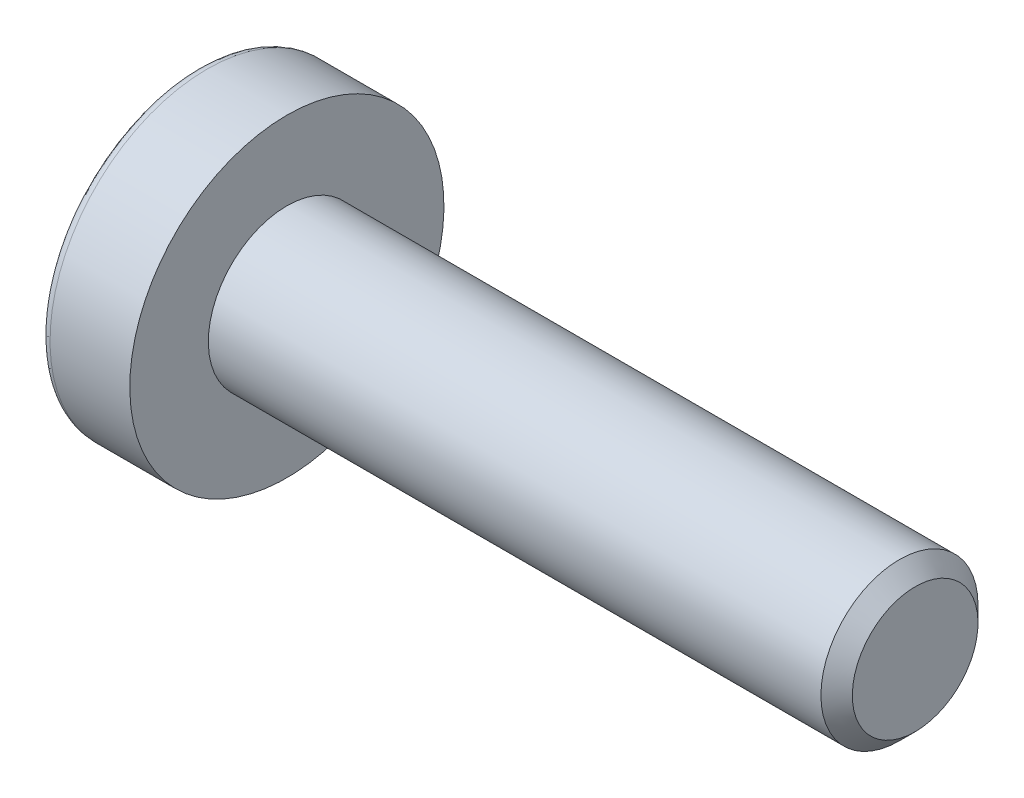
ISO-10303-21;
HEADER;
FILE_DESCRIPTION(('STEP AP214'),'2;1');
FILE_NAME('part.step','',(''),(''),'','','');
FILE_SCHEMA(('AUTOMOTIVE_DESIGN { 1 0 10303 214 1 1 1 1 }'));
ENDSEC;
DATA;
#1=APPLICATION_CONTEXT('core data for automotive mechanical design processes');
#2=APPLICATION_PROTOCOL_DEFINITION('international standard','automotive_design',2000,#1);
#3=PRODUCT_CONTEXT('',#1,'mechanical');
#4=PRODUCT('Part','Part','',(#3));
#5=PRODUCT_RELATED_PRODUCT_CATEGORY('part','',(#4));
#6=PRODUCT_DEFINITION_FORMATION('','',#4);
#7=PRODUCT_DEFINITION_CONTEXT('part definition',#1,'design');
#8=PRODUCT_DEFINITION('design','',#6,#7);
#9=PRODUCT_DEFINITION_SHAPE('','',#8);
#10=(LENGTH_UNIT() NAMED_UNIT(*) SI_UNIT(.MILLI.,.METRE.));
#11=(NAMED_UNIT(*) PLANE_ANGLE_UNIT() SI_UNIT($,.RADIAN.));
#12=(NAMED_UNIT(*) SI_UNIT($,.STERADIAN.) SOLID_ANGLE_UNIT());
#13=UNCERTAINTY_MEASURE_WITH_UNIT(LENGTH_MEASURE(1.E-05),#10,'distance_accuracy_value','');
#14=(GEOMETRIC_REPRESENTATION_CONTEXT(3) GLOBAL_UNCERTAINTY_ASSIGNED_CONTEXT((#13)) GLOBAL_UNIT_ASSIGNED_CONTEXT((#10,
#11,#12)) REPRESENTATION_CONTEXT('',''));
#15=CARTESIAN_POINT('',(0.,0.,0.));
#16=DIRECTION('',(0.,0.,1.));
#17=DIRECTION('',(1.,0.,0.));
#18=AXIS2_PLACEMENT_3D('',#15,#16,#17);
#19=CARTESIAN_POINT('',(-17.,-2.1,0.5));
#20=DIRECTION('',(0.052335956242944,0.,0.998629534754574));
#21=DIRECTION('',(0.998629534754574,0.,-0.052335956242944));
#22=AXIS2_PLACEMENT_3D('',#19,#20,#21);
#23=PLANE('',#22);
#24=DIRECTION('',(0.997264688634237,0.0522644276887144,-0.0522644276887139));
#25=VECTOR('',#24,1.);
#26=CARTESIAN_POINT('',(-18.9649809236718,-0.602980286543183,0.60298028654318));
#27=LINE('',#26,#25);
#28=CARTESIAN_POINT('',(-18.9649809236718,-0.602980286543183,0.602980286543179));
#29=VERTEX_POINT('',#28);
#30=CARTESIAN_POINT('',(-17.,-0.500000000000004,0.500000000000001));
#31=VERTEX_POINT('',#30);
#32=EDGE_CURVE('E392',#29,#31,#27,.T.);
#33=ORIENTED_EDGE('',*,*,#32,.T.);
#34=DIRECTION('',(0.,1.,0.));
#35=VECTOR('',#34,1.);
#36=CARTESIAN_POINT('',(-17.,-2.1,0.5));
#37=LINE('',#36,#35);
#38=CARTESIAN_POINT('',(-17.,-2.1,0.5));
#39=VERTEX_POINT('',#38);
#40=EDGE_CURVE('E98',#39,#31,#37,.T.);
#41=ORIENTED_EDGE('',*,*,#40,.F.);
#42=DIRECTION('',(-0.997264688634237,-0.0522644276887142,0.0522644276887141));
#43=VECTOR('',#42,1.);
#44=CARTESIAN_POINT('',(-17.,-2.1,0.5));
#45=LINE('',#44,#43);
#46=CARTESIAN_POINT('',(-18.7492116166374,-2.19167229632422,0.591672296324065));
#47=VERTEX_POINT('',#46);
#48=EDGE_CURVE('E319',#39,#47,#45,.T.);
#49=ORIENTED_EDGE('',*,*,#48,.T.);
#50=CARTESIAN_POINT('',(-18.9649809236718,-0.602980286543183,0.602980286543179));
#51=CARTESIAN_POINT('',(-18.9494321809181,-0.870542282454416,0.602165411464815));
#52=CARTESIAN_POINT('',(-18.9236770339551,-1.13671428122513,0.600815641407373));
#53=CARTESIAN_POINT('',(-18.8517539316103,-1.66627828448553,0.597046311334334));
#54=CARTESIAN_POINT('',(-18.8055859762285,-1.92967028897521,0.594626751318737));
#55=CARTESIAN_POINT('',(-18.7492116166374,-2.19167229632437,0.591672296324061));
#56=B_SPLINE_CURVE_WITH_KNOTS('',3,(#50,#51,#52,#53,#54,#55),.UNSPECIFIED.,.F.,.F.,(4,2,4),(0.,
0.802255658524791,1.60451131704958),.UNSPECIFIED.);
#57=EDGE_CURVE('E20',#29,#47,#56,.T.);
#58=ORIENTED_EDGE('',*,*,#57,.F.);
#59=EDGE_LOOP('',(#33,#41,#49,#58));
#60=FACE_BOUND('',#59,.T.);
#61=ADVANCED_FACE('F16',(#60),#23,.F.);
#62=CARTESIAN_POINT('',(-17.,-0.499999999999995,-2.1));
#63=DIRECTION('',(0.0523359562429441,-0.998629534754574,0.));
#64=DIRECTION('',(0.998629534754574,0.0523359562429441,0.));
#65=AXIS2_PLACEMENT_3D('',#62,#63,#64);
#66=PLANE('',#65);
#67=DIRECTION('',(0.997264688634237,0.0522644276887144,-0.0522644276887137));
#68=VECTOR('',#67,1.);
#69=CARTESIAN_POINT('',(-18.7492116166374,-0.591672296324076,2.19167229632406));
#70=LINE('',#69,#68);
#71=CARTESIAN_POINT('',(-18.7492116166374,-0.591672296324076,2.19167229632407));
#72=VERTEX_POINT('',#71);
#73=CARTESIAN_POINT('',(-17.,-0.500000000000009,2.1));
#74=VERTEX_POINT('',#73);
#75=EDGE_CURVE('E307',#72,#74,#70,.T.);
#76=ORIENTED_EDGE('',*,*,#75,.T.);
#77=DIRECTION('',(0.,0.,1.));
#78=VECTOR('',#77,1.);
#79=CARTESIAN_POINT('',(-17.,-0.499999999999995,-2.1));
#80=LINE('',#79,#78);
#81=EDGE_CURVE('E390',#31,#74,#80,.T.);
#82=ORIENTED_EDGE('',*,*,#81,.F.);
#83=ORIENTED_EDGE('',*,*,#32,.F.);
#84=CARTESIAN_POINT('',(-18.7492116166374,-0.591672296324076,2.19167229632407));
#85=CARTESIAN_POINT('',(-18.8055859762285,-0.594626751318749,1.92967028897495));
#86=CARTESIAN_POINT('',(-18.8517539316103,-0.597046311334344,1.66627828448532));
#87=CARTESIAN_POINT('',(-18.9236770339551,-0.60081564140738,1.13671428122503));
#88=CARTESIAN_POINT('',(-18.9494321809181,-0.60216541146482,0.870542282454362));
#89=CARTESIAN_POINT('',(-18.9649809236718,-0.602980286543182,0.602980286543181));
#90=B_SPLINE_CURVE_WITH_KNOTS('',3,(#84,#85,#86,#87,#88,#89),.UNSPECIFIED.,.F.,.F.,(4,2,4),(0.,
0.802255658524635,1.60451131704927),.UNSPECIFIED.);
#91=EDGE_CURVE('E238',#72,#29,#90,.T.);
#92=ORIENTED_EDGE('',*,*,#91,.F.);
#93=EDGE_LOOP('',(#76,#82,#83,#92));
#94=FACE_BOUND('',#93,.T.);
#95=ADVANCED_FACE('F330',(#94),#66,.F.);
#96=CARTESIAN_POINT('',(-17.,-2.1,0.5));
#97=DIRECTION('',(0.0523359562429441,-0.998629534754574,0.));
#98=DIRECTION('',(0.998629534754574,0.0523359562429441,0.));
#99=AXIS2_PLACEMENT_3D('',#96,#97,#98);
#100=PLANE('',#99);
#101=CARTESIAN_POINT('',(-18.7492116166374,-2.19167229632407,0.591672296324066));
#102=CARTESIAN_POINT('',(-18.7662509048177,-2.19256528757816,0.296082175208422));
#103=CARTESIAN_POINT('',(-18.7662509048177,-2.19256528757816,0.));
#104=B_SPLINE_CURVE_WITH_KNOTS('',2,(#101,#102,#103),.UNSPECIFIED.,.F.,.F.,(3,3),(0.,1.),.UNSPECIFIED.);
#105=CARTESIAN_POINT('',(-18.7662509048177,-2.19256528757816,0.));
#106=VERTEX_POINT('',#105);
#107=EDGE_CURVE('E316',#47,#106,#104,.T.);
#108=ORIENTED_EDGE('',*,*,#107,.F.);
#109=ORIENTED_EDGE('',*,*,#48,.F.);
#110=DIRECTION('',(0.,0.,1.));
#111=VECTOR('',#110,1.);
#112=CARTESIAN_POINT('',(-17.,-2.1,0.5));
#113=LINE('',#112,#111);
#114=CARTESIAN_POINT('',(-17.,-2.1,-0.500000000000001));
#115=VERTEX_POINT('',#114);
#116=EDGE_CURVE('E398',#115,#39,#113,.T.);
#117=ORIENTED_EDGE('',*,*,#116,.F.);
#118=DIRECTION('',(-0.997264688634237,-0.0522644276887142,-0.052264427688714));
#119=VECTOR('',#118,1.);
#120=CARTESIAN_POINT('',(-17.,-2.1,-0.5));
#121=LINE('',#120,#119);
#122=CARTESIAN_POINT('',(-18.7492116166374,-2.19167229632407,-0.591672296324066));
#123=VERTEX_POINT('',#122);
#124=EDGE_CURVE('E286',#115,#123,#121,.T.);
#125=ORIENTED_EDGE('',*,*,#124,.T.);
#126=CARTESIAN_POINT('',(-18.7662509048177,-2.19256528757816,0.));
#127=CARTESIAN_POINT('',(-18.7662509048177,-2.19256528757816,-0.296082175208425));
#128=CARTESIAN_POINT('',(-18.7492116166374,-2.19167229632407,-0.591672296324067));
#129=B_SPLINE_CURVE_WITH_KNOTS('',2,(#126,#127,#128),.UNSPECIFIED.,.F.,.F.,(3,3),(0.,1.),.UNSPECIFIED.);
#130=EDGE_CURVE('E310',#106,#123,#129,.T.);
#131=ORIENTED_EDGE('',*,*,#130,.F.);
#132=EDGE_LOOP('',(#108,#109,#117,#125,#131));
#133=FACE_BOUND('',#132,.T.);
#134=ADVANCED_FACE('F322',(#133),#100,.F.);
#135=CARTESIAN_POINT('',(-17.,-0.500000000000009,2.1));
#136=DIRECTION('',(0.052335956242944,0.,0.998629534754574));
#137=DIRECTION('',(0.998629534754574,0.,-0.052335956242944));
#138=AXIS2_PLACEMENT_3D('',#135,#136,#137);
#139=PLANE('',#138);
#140=DIRECTION('',(0.997264688634237,-0.0522644276887137,-0.0522644276887149));
#141=VECTOR('',#140,1.);
#142=CARTESIAN_POINT('',(-18.7492116166374,0.591672296324056,2.19167229632407));
#143=LINE('',#142,#141);
#144=CARTESIAN_POINT('',(-18.7492116166374,0.591672296324055,2.19167229632407));
#145=VERTEX_POINT('',#144);
#146=CARTESIAN_POINT('',(-17.,0.499999999999991,2.1));
#147=VERTEX_POINT('',#146);
#148=EDGE_CURVE('E290',#145,#147,#143,.T.);
#149=ORIENTED_EDGE('',*,*,#148,.T.);
#150=DIRECTION('',(0.,1.,0.));
#151=VECTOR('',#150,1.);
#152=CARTESIAN_POINT('',(-17.,-0.500000000000009,2.1));
#153=LINE('',#152,#151);
#154=EDGE_CURVE('E298',#74,#147,#153,.T.);
#155=ORIENTED_EDGE('',*,*,#154,.F.);
#156=ORIENTED_EDGE('',*,*,#75,.F.);
#157=CARTESIAN_POINT('',(-18.7492116166374,0.591672296324055,2.19167229632407));
#158=CARTESIAN_POINT('',(-18.760571142091,0.394448197549367,2.1922676238268));
#159=CARTESIAN_POINT('',(-18.7662509048177,0.197224098774678,2.19256528757816));
#160=CARTESIAN_POINT('',(-18.7662509048177,-0.197224098774699,2.19256528757816));
#161=CARTESIAN_POINT('',(-18.760571142091,-0.394448197549388,2.19226762382679));
#162=CARTESIAN_POINT('',(-18.7492116166374,-0.591672296324076,2.19167229632407));
#163=B_SPLINE_CURVE_WITH_KNOTS('',3,(#157,#158,#159,#160,#161,#162),.UNSPECIFIED.,.F.,.F.,(4,2,
4),(0.,0.591918272240741,1.18383654448148),.UNSPECIFIED.);
#164=EDGE_CURVE('E246',#145,#72,#163,.T.);
#165=ORIENTED_EDGE('',*,*,#164,.F.);
#166=EDGE_LOOP('',(#149,#155,#156,#165));
#167=FACE_BOUND('',#166,.T.);
#168=ADVANCED_FACE('F276',(#167),#139,.F.);
#169=CARTESIAN_POINT('',(-17.,-2.1,-0.5));
#170=DIRECTION('',(0.052335956242944,0.,-0.998629534754574));
#171=DIRECTION('',(-0.998629534754574,0.,-0.052335956242944));
#172=AXIS2_PLACEMENT_3D('',#169,#170,#171);
#173=PLANE('',#172);
#174=DIRECTION('',(-0.997264688634237,-0.052264427688714,-0.052264427688714));
#175=VECTOR('',#174,1.);
#176=CARTESIAN_POINT('',(-17.,-0.5,-0.499999999999999));
#177=LINE('',#176,#175);
#178=CARTESIAN_POINT('',(-17.,-0.5,-0.499999999999999));
#179=VERTEX_POINT('',#178);
#180=CARTESIAN_POINT('',(-18.9649809236718,-0.602980286543179,-0.602980286543179));
#181=VERTEX_POINT('',#180);
#182=EDGE_CURVE('E263',#179,#181,#177,.T.);
#183=ORIENTED_EDGE('',*,*,#182,.T.);
#184=CARTESIAN_POINT('',(-18.7492116166374,-2.19167229632437,-0.591672296324067));
#185=CARTESIAN_POINT('',(-18.8055859762285,-1.92967028897521,-0.594626751318739));
#186=CARTESIAN_POINT('',(-18.8517539316103,-1.66627828448553,-0.597046311334335));
#187=CARTESIAN_POINT('',(-18.9236770339551,-1.13671428122513,-0.600815641407373));
#188=CARTESIAN_POINT('',(-18.9494321809181,-0.870542282454412,-0.602165411464815));
#189=CARTESIAN_POINT('',(-18.9649809236718,-0.602980286543178,-0.60298028654318));
#190=B_SPLINE_CURVE_WITH_KNOTS('',3,(#184,#185,#186,#187,#188,#189),.UNSPECIFIED.,.F.,.F.,(4,2,
4),(0.,0.802255658524794,1.60451131704959),.UNSPECIFIED.);
#191=EDGE_CURVE('E280',#123,#181,#190,.T.);
#192=ORIENTED_EDGE('',*,*,#191,.F.);
#193=ORIENTED_EDGE('',*,*,#124,.F.);
#194=DIRECTION('',(0.,1.,0.));
#195=VECTOR('',#194,1.);
#196=CARTESIAN_POINT('',(-17.,-2.1,-0.5));
#197=LINE('',#196,#195);
#198=EDGE_CURVE('E285',#179,#115,#197,.F.);
#199=ORIENTED_EDGE('',*,*,#198,.F.);
#200=EDGE_LOOP('',(#183,#192,#193,#199));
#201=FACE_BOUND('',#200,.T.);
#202=ADVANCED_FACE('F272',(#201),#173,.F.);
#203=CARTESIAN_POINT('',(-17.,0.500000000000005,-2.1));
#204=DIRECTION('',(0.0523359562429438,0.998629534754574,0.));
#205=DIRECTION('',(-0.998629534754574,0.0523359562429438,0.));
#206=AXIS2_PLACEMENT_3D('',#203,#204,#205);
#207=PLANE('',#206);
#208=DIRECTION('',(0.997264688634237,-0.0522644276887128,-0.0522644276887141));
#209=VECTOR('',#208,1.);
#210=CARTESIAN_POINT('',(-18.9649809236718,0.602980286543174,0.602980286543179));
#211=LINE('',#210,#209);
#212=CARTESIAN_POINT('',(-18.9649809236718,0.602980286543173,0.602980286543179));
#213=VERTEX_POINT('',#212);
#214=CARTESIAN_POINT('',(-17.,0.499999999999997,0.5));
#215=VERTEX_POINT('',#214);
#216=EDGE_CURVE('E417',#213,#215,#211,.T.);
#217=ORIENTED_EDGE('',*,*,#216,.T.);
#218=DIRECTION('',(0.,0.,1.));
#219=VECTOR('',#218,1.);
#220=CARTESIAN_POINT('',(-17.,0.500000000000005,-2.1));
#221=LINE('',#220,#219);
#222=EDGE_CURVE('E410',#147,#215,#221,.F.);
#223=ORIENTED_EDGE('',*,*,#222,.F.);
#224=ORIENTED_EDGE('',*,*,#148,.F.);
#225=CARTESIAN_POINT('',(-18.9649809236718,0.602980286543173,0.602980286543179));
#226=CARTESIAN_POINT('',(-18.9494321809181,0.602165411464808,0.87054228245436));
#227=CARTESIAN_POINT('',(-18.9236770339551,0.600815641407367,1.13671428122503));
#228=CARTESIAN_POINT('',(-18.8517539316103,0.597046311334329,1.66627828448532));
#229=CARTESIAN_POINT('',(-18.8055859762285,0.594626751318733,1.92967028897495));
#230=CARTESIAN_POINT('',(-18.7492116166374,0.591672296324059,2.19167229632407));
#231=B_SPLINE_CURVE_WITH_KNOTS('',3,(#225,#226,#227,#228,#229,#230),.UNSPECIFIED.,.F.,.F.,(4,2,
4),(0.,0.802255658524637,1.60451131704927),.UNSPECIFIED.);
#232=EDGE_CURVE('E231',#213,#145,#231,.T.);
#233=ORIENTED_EDGE('',*,*,#232,.F.);
#234=EDGE_LOOP('',(#217,#223,#224,#233));
#235=FACE_BOUND('',#234,.T.);
#236=ADVANCED_FACE('F267',(#235),#207,.F.);
#237=CARTESIAN_POINT('',(-17.,-0.499999999999995,-2.1));
#238=DIRECTION('',(0.0523359562429441,-0.998629534754574,0.));
#239=DIRECTION('',(0.998629534754574,0.0523359562429441,0.));
#240=AXIS2_PLACEMENT_3D('',#237,#238,#239);
#241=PLANE('',#240);
#242=ORIENTED_EDGE('',*,*,#182,.F.);
#243=DIRECTION('',(0.,0.,1.));
#244=VECTOR('',#243,1.);
#245=CARTESIAN_POINT('',(-17.,-0.499999999999995,-2.1));
#246=LINE('',#245,#244);
#247=CARTESIAN_POINT('',(-17.,-0.499999999999995,-2.1));
#248=VERTEX_POINT('',#247);
#249=EDGE_CURVE('E419',#248,#179,#246,.T.);
#250=ORIENTED_EDGE('',*,*,#249,.F.);
#251=DIRECTION('',(-0.997264688634237,-0.0522644276887138,-0.0522644276887142));
#252=VECTOR('',#251,1.);
#253=CARTESIAN_POINT('',(-17.,-0.499999999999995,-2.1));
#254=LINE('',#253,#252);
#255=CARTESIAN_POINT('',(-18.7492116166374,-0.59167229632406,-2.19167229632407));
#256=VERTEX_POINT('',#255);
#257=EDGE_CURVE('E204',#248,#256,#254,.T.);
#258=ORIENTED_EDGE('',*,*,#257,.T.);
#259=CARTESIAN_POINT('',(-18.9649809236718,-0.602980286543178,-0.60298028654318));
#260=CARTESIAN_POINT('',(-18.9494321809181,-0.602165411464813,-0.870542282454361));
#261=CARTESIAN_POINT('',(-18.9236770339551,-0.600815641407371,-1.13671428122503));
#262=CARTESIAN_POINT('',(-18.8517539316103,-0.597046311334333,-1.66627828448532));
#263=CARTESIAN_POINT('',(-18.8055859762285,-0.594626751318737,-1.92967028897495));
#264=CARTESIAN_POINT('',(-18.7492116166374,-0.591672296324064,-2.19167229632407));
#265=B_SPLINE_CURVE_WITH_KNOTS('',3,(#259,#260,#261,#262,#263,#264),.UNSPECIFIED.,.F.,.F.,(4,2,
4),(0.,0.802255658524637,1.60451131704928),.UNSPECIFIED.);
#266=EDGE_CURVE('E258',#181,#256,#265,.T.);
#267=ORIENTED_EDGE('',*,*,#266,.F.);
#268=EDGE_LOOP('',(#242,#250,#258,#267));
#269=FACE_BOUND('',#268,.T.);
#270=ADVANCED_FACE('F264',(#269),#241,.F.);
#271=CARTESIAN_POINT('',(-17.,-2.1,0.5));
#272=DIRECTION('',(0.052335956242944,0.,0.998629534754574));
#273=DIRECTION('',(0.998629534754574,0.,-0.052335956242944));
#274=AXIS2_PLACEMENT_3D('',#271,#272,#273);
#275=PLANE('',#274);
#276=ORIENTED_EDGE('',*,*,#216,.F.);
#277=CARTESIAN_POINT('',(-18.7492116166374,2.19167229632437,0.591672296324063));
#278=CARTESIAN_POINT('',(-18.8055859762285,1.9296702889752,0.594626751318737));
#279=CARTESIAN_POINT('',(-18.8517539316103,1.66627828448552,0.597046311334334));
#280=CARTESIAN_POINT('',(-18.9236770339551,1.13671428122512,0.600815641407373));
#281=CARTESIAN_POINT('',(-18.9494321809181,0.870542282454407,0.602165411464814));
#282=CARTESIAN_POINT('',(-18.9649809236718,0.602980286543174,0.602980286543178));
#283=B_SPLINE_CURVE_WITH_KNOTS('',3,(#277,#278,#279,#280,#281,#282),.UNSPECIFIED.,.F.,.F.,(4,2,
4),(0.,0.802255658524794,1.60451131704959),.UNSPECIFIED.);
#284=CARTESIAN_POINT('',(-18.7492116166374,2.19167229632422,0.591672296324065));
#285=VERTEX_POINT('',#284);
#286=EDGE_CURVE('E209',#285,#213,#283,.T.);
#287=ORIENTED_EDGE('',*,*,#286,.F.);
#288=DIRECTION('',(0.997264688634237,-0.0522644276887139,-0.0522644276887141));
#289=VECTOR('',#288,1.);
#290=CARTESIAN_POINT('',(-18.7492116166374,2.19167229632406,0.591672296324066));
#291=LINE('',#290,#289);
#292=CARTESIAN_POINT('',(-17.,2.1,0.5));
#293=VERTEX_POINT('',#292);
#294=EDGE_CURVE('E173',#285,#293,#291,.T.);
#295=ORIENTED_EDGE('',*,*,#294,.T.);
#296=DIRECTION('',(0.,1.,0.));
#297=VECTOR('',#296,1.);
#298=CARTESIAN_POINT('',(-17.,-2.1,0.5));
#299=LINE('',#298,#297);
#300=EDGE_CURVE('E431',#215,#293,#299,.T.);
#301=ORIENTED_EDGE('',*,*,#300,.F.);
#302=EDGE_LOOP('',(#276,#287,#295,#301));
#303=FACE_BOUND('',#302,.T.);
#304=ADVANCED_FACE('F192',(#303),#275,.F.);
#305=CARTESIAN_POINT('',(-17.,-0.499999999999995,-2.1));
#306=DIRECTION('',(0.052335956242944,0.,-0.998629534754574));
#307=DIRECTION('',(-0.998629534754574,0.,-0.052335956242944));
#308=AXIS2_PLACEMENT_3D('',#305,#306,#307);
#309=PLANE('',#308);
#310=ORIENTED_EDGE('',*,*,#257,.F.);
#311=DIRECTION('',(0.,1.,0.));
#312=VECTOR('',#311,1.);
#313=CARTESIAN_POINT('',(-17.,2.1,-2.1));
#314=LINE('',#313,#312);
#315=CARTESIAN_POINT('',(-17.,0.500000000000003,-2.1));
#316=VERTEX_POINT('',#315);
#317=EDGE_CURVE('E166',#316,#248,#314,.F.);
#318=ORIENTED_EDGE('',*,*,#317,.F.);
#319=DIRECTION('',(-0.997264688634237,0.0522644276887141,-0.0522644276887135));
#320=VECTOR('',#319,1.);
#321=CARTESIAN_POINT('',(-17.,0.500000000000005,-2.1));
#322=LINE('',#321,#320);
#323=CARTESIAN_POINT('',(-18.7492116166374,0.591672296324072,-2.19167229632406));
#324=VERTEX_POINT('',#323);
#325=EDGE_CURVE('E140',#316,#324,#322,.T.);
#326=ORIENTED_EDGE('',*,*,#325,.T.);
#327=CARTESIAN_POINT('',(-18.7492116166374,-0.59167229632406,-2.19167229632407));
#328=CARTESIAN_POINT('',(-18.760571142091,-0.394448197549372,-2.1922676238268));
#329=CARTESIAN_POINT('',(-18.7662509048177,-0.197224098774683,-2.19256528757816));
#330=CARTESIAN_POINT('',(-18.7662509048177,0.197224098774694,-2.19256528757816));
#331=CARTESIAN_POINT('',(-18.760571142091,0.394448197549383,-2.19226762382679));
#332=CARTESIAN_POINT('',(-18.7492116166374,0.591672296324071,-2.19167229632406));
#333=B_SPLINE_CURVE_WITH_KNOTS('',3,(#327,#328,#329,#330,#331,#332),.UNSPECIFIED.,.F.,.F.,(4,2,
4),(0.,0.591918272240741,1.18383654448148),.UNSPECIFIED.);
#334=EDGE_CURVE('E197',#256,#324,#333,.T.);
#335=ORIENTED_EDGE('',*,*,#334,.F.);
#336=EDGE_LOOP('',(#310,#318,#326,#335));
#337=FACE_BOUND('',#336,.T.);
#338=ADVANCED_FACE('F186',(#337),#309,.F.);
#339=CARTESIAN_POINT('',(-17.,2.1,0.5));
#340=DIRECTION('',(0.0523359562429438,0.998629534754574,0.));
#341=DIRECTION('',(-0.998629534754574,0.0523359562429438,0.));
#342=AXIS2_PLACEMENT_3D('',#339,#340,#341);
#343=PLANE('',#342);
#344=CARTESIAN_POINT('',(-18.7492116166374,2.19167229632406,-0.591672296324067));
#345=CARTESIAN_POINT('',(-18.7662509048177,2.19256528757816,-0.296082175208414));
#346=CARTESIAN_POINT('',(-18.7662509048177,2.19256528757816,0.));
#347=B_SPLINE_CURVE_WITH_KNOTS('',2,(#344,#345,#346),.UNSPECIFIED.,.F.,.F.,(3,3),(0.,1.),.UNSPECIFIED.);
#348=CARTESIAN_POINT('',(-18.7492116166374,2.19167229632407,-0.591672296324066));
#349=VERTEX_POINT('',#348);
#350=CARTESIAN_POINT('',(-18.7662509048177,2.19256528757816,0.));
#351=VERTEX_POINT('',#350);
#352=EDGE_CURVE('E40',#349,#351,#347,.T.);
#353=ORIENTED_EDGE('',*,*,#352,.F.);
#354=DIRECTION('',(0.997264688634237,-0.0522644276887144,0.052264427688714));
#355=VECTOR('',#354,1.);
#356=CARTESIAN_POINT('',(-18.7492116166374,2.19167229632407,-0.591672296324066));
#357=LINE('',#356,#355);
#358=CARTESIAN_POINT('',(-17.,2.1,-0.5));
#359=VERTEX_POINT('',#358);
#360=EDGE_CURVE('E132',#349,#359,#357,.T.);
#361=ORIENTED_EDGE('',*,*,#360,.T.);
#362=DIRECTION('',(0.,0.,1.));
#363=VECTOR('',#362,1.);
#364=CARTESIAN_POINT('',(-17.,2.1,0.5));
#365=LINE('',#364,#363);
#366=EDGE_CURVE('E128',#293,#359,#365,.F.);
#367=ORIENTED_EDGE('',*,*,#366,.F.);
#368=ORIENTED_EDGE('',*,*,#294,.F.);
#369=CARTESIAN_POINT('',(-18.7662509048177,2.19256528757816,0.));
#370=CARTESIAN_POINT('',(-18.7662509048177,2.19256528757816,0.29608217520846));
#371=CARTESIAN_POINT('',(-18.7492116166374,2.19167229632406,0.591672296324066));
#372=B_SPLINE_CURVE_WITH_KNOTS('',2,(#369,#370,#371),.UNSPECIFIED.,.F.,.F.,(3,3),(0.,1.),.UNSPECIFIED.);
#373=EDGE_CURVE('E172',#351,#285,#372,.T.);
#374=ORIENTED_EDGE('',*,*,#373,.F.);
#375=EDGE_LOOP('',(#353,#361,#367,#368,#374));
#376=FACE_BOUND('',#375,.T.);
#377=ADVANCED_FACE('F176',(#376),#343,.F.);
#378=CARTESIAN_POINT('',(-17.,2.1,0.5));
#379=DIRECTION('',(-1.,0.,0.));
#380=DIRECTION('',(0.,0.,1.));
#381=AXIS2_PLACEMENT_3D('',#378,#379,#380);
#382=PLANE('',#381);
#383=ORIENTED_EDGE('',*,*,#300,.T.);
#384=ORIENTED_EDGE('',*,*,#366,.T.);
#385=DIRECTION('',(0.,1.,0.));
#386=VECTOR('',#385,1.);
#387=CARTESIAN_POINT('',(-17.,-2.1,-0.5));
#388=LINE('',#387,#386);
#389=CARTESIAN_POINT('',(-17.,0.499999999999999,-0.5));
#390=VERTEX_POINT('',#389);
#391=EDGE_CURVE('E121',#359,#390,#388,.F.);
#392=ORIENTED_EDGE('',*,*,#391,.T.);
#393=DIRECTION('',(0.,0.,1.));
#394=VECTOR('',#393,1.);
#395=CARTESIAN_POINT('',(-17.,0.500000000000005,-2.1));
#396=LINE('',#395,#394);
#397=EDGE_CURVE('E125',#390,#316,#396,.F.);
#398=ORIENTED_EDGE('',*,*,#397,.T.);
#399=ORIENTED_EDGE('',*,*,#317,.T.);
#400=ORIENTED_EDGE('',*,*,#249,.T.);
#401=ORIENTED_EDGE('',*,*,#198,.T.);
#402=ORIENTED_EDGE('',*,*,#116,.T.);
#403=ORIENTED_EDGE('',*,*,#40,.T.);
#404=ORIENTED_EDGE('',*,*,#81,.T.);
#405=ORIENTED_EDGE('',*,*,#154,.T.);
#406=ORIENTED_EDGE('',*,*,#222,.T.);
#407=EDGE_LOOP('',(#383,#384,#392,#398,#399,#400,#401,#402,#403,#404,#405,#406));
#408=FACE_BOUND('',#407,.T.);
#409=ADVANCED_FACE('F123',(#408),#382,.T.);
#410=CARTESIAN_POINT('',(-17.,0.500000000000005,-2.1));
#411=DIRECTION('',(0.0523359562429438,0.998629534754574,0.));
#412=DIRECTION('',(-0.998629534754574,0.0523359562429438,0.));
#413=AXIS2_PLACEMENT_3D('',#410,#411,#412);
#414=PLANE('',#413);
#415=ORIENTED_EDGE('',*,*,#325,.F.);
#416=ORIENTED_EDGE('',*,*,#397,.F.);
#417=DIRECTION('',(-0.997264688634237,0.0522644276887141,-0.0522644276887141));
#418=VECTOR('',#417,1.);
#419=CARTESIAN_POINT('',(-17.,0.5,-0.5));
#420=LINE('',#419,#418);
#421=CARTESIAN_POINT('',(-18.9649809236718,0.602980286543178,-0.602980286543179));
#422=VERTEX_POINT('',#421);
#423=EDGE_CURVE('E131',#390,#422,#420,.T.);
#424=ORIENTED_EDGE('',*,*,#423,.T.);
#425=CARTESIAN_POINT('',(-18.7492116166374,0.591672296324071,-2.19167229632407));
#426=CARTESIAN_POINT('',(-18.8055859762285,0.594626751318744,-1.92967028897495));
#427=CARTESIAN_POINT('',(-18.8517539316103,0.597046311334339,-1.66627828448532));
#428=CARTESIAN_POINT('',(-18.9236770339551,0.600815641407376,-1.13671428122503));
#429=CARTESIAN_POINT('',(-18.9494321809181,0.602165411464817,-0.870542282454361));
#430=CARTESIAN_POINT('',(-18.9649809236718,0.602980286543182,-0.60298028654318));
#431=B_SPLINE_CURVE_WITH_KNOTS('',3,(#425,#426,#427,#428,#429,#430),.UNSPECIFIED.,.F.,.F.,(4,2,
4),(0.,0.802255658524638,1.60451131704928),.UNSPECIFIED.);
#432=EDGE_CURVE('E155',#324,#422,#431,.T.);
#433=ORIENTED_EDGE('',*,*,#432,.F.);
#434=EDGE_LOOP('',(#415,#416,#424,#433));
#435=FACE_BOUND('',#434,.T.);
#436=ADVANCED_FACE('F136',(#435),#414,.F.);
#437=CARTESIAN_POINT('',(-17.,-2.1,-0.5));
#438=DIRECTION('',(0.052335956242944,0.,-0.998629534754574));
#439=DIRECTION('',(-0.998629534754574,0.,-0.052335956242944));
#440=AXIS2_PLACEMENT_3D('',#437,#438,#439);
#441=PLANE('',#440);
#442=ORIENTED_EDGE('',*,*,#423,.F.);
#443=ORIENTED_EDGE('',*,*,#391,.F.);
#444=ORIENTED_EDGE('',*,*,#360,.F.);
#445=CARTESIAN_POINT('',(-18.9649809236718,0.602980286543178,-0.60298028654318));
#446=CARTESIAN_POINT('',(-18.9494321809283,0.870542282280296,-0.602165411465349));
#447=CARTESIAN_POINT('',(-18.9236770339886,1.13671428087921,-0.60081564140913));
#448=CARTESIAN_POINT('',(-18.8517539317167,1.66627828380062,-0.597046311339915));
#449=CARTESIAN_POINT('',(-18.8055859763846,1.92967028812313,-0.594626751326919));
#450=CARTESIAN_POINT('',(-18.7492116168563,2.19167229530742,-0.591672296335534));
#451=B_SPLINE_CURVE_WITH_KNOTS('',3,(#445,#446,#447,#448,#449,#450),.UNSPECIFIED.,.F.,.F.,(4,2,
4),(0.,0.802255658005024,1.60451131601005),.UNSPECIFIED.);
#452=EDGE_CURVE('E144',#422,#349,#451,.T.);
#453=ORIENTED_EDGE('',*,*,#452,.F.);
#454=EDGE_LOOP('',(#442,#443,#444,#453));
#455=FACE_BOUND('',#454,.T.);
#456=ADVANCED_FACE('F142',(#455),#441,.F.);
#457=CARTESIAN_POINT('',(-8.59999999999998,0.,0.));
#458=DIRECTION('',(0.,1.,0.));
#459=DIRECTION('',(-1.,0.,0.));
#460=AXIS2_PLACEMENT_3D('',#457,#458,#459);
#461=SPHERICAL_SURFACE('',#460,10.4);
#462=ORIENTED_EDGE('',*,*,#107,.T.);
#463=ORIENTED_EDGE('',*,*,#130,.T.);
#464=ORIENTED_EDGE('',*,*,#191,.T.);
#465=ORIENTED_EDGE('',*,*,#266,.T.);
#466=ORIENTED_EDGE('',*,*,#334,.T.);
#467=ORIENTED_EDGE('',*,*,#432,.T.);
#468=ORIENTED_EDGE('',*,*,#452,.T.);
#469=ORIENTED_EDGE('',*,*,#352,.T.);
#470=ORIENTED_EDGE('',*,*,#373,.T.);
#471=ORIENTED_EDGE('',*,*,#286,.T.);
#472=ORIENTED_EDGE('',*,*,#232,.T.);
#473=ORIENTED_EDGE('',*,*,#164,.T.);
#474=ORIENTED_EDGE('',*,*,#91,.T.);
#475=ORIENTED_EDGE('',*,*,#57,.T.);
#476=EDGE_LOOP('',(#462,#463,#464,#465,#466,#467,#468,#469,#470,#471,#472,#473,#474,#475));
#477=FACE_BOUND('',#476,.T.);
#478=CARTESIAN_POINT('',(-18.2641727428206,0.,0.));
#479=DIRECTION('',(1.,0.,0.));
#480=DIRECTION('',(0.,1.,0.));
#481=AXIS2_PLACEMENT_3D('',#478,#479,#480);
#482=CIRCLE('',#481,3.8423645320197);
#483=CARTESIAN_POINT('',(-18.2641727428206,3.8423645320197,0.));
#484=VERTEX_POINT('',#483);
#485=EDGE_CURVE('E146',#484,#484,#482,.T.);
#486=ORIENTED_EDGE('',*,*,#485,.F.);
#487=EDGE_LOOP('',(#486));
#488=FACE_BOUND('',#487,.T.);
#489=ADVANCED_FACE('F215',(#477,#488),#461,.T.);
#490=CARTESIAN_POINT('',(-18.0318608980413,0.,0.));
#491=DIRECTION('',(1.,0.,0.));
#492=DIRECTION('',(0.,1.,0.));
#493=AXIS2_PLACEMENT_3D('',#490,#491,#492);
#494=TOROIDAL_SURFACE('',#493,3.75,0.25);
#495=ORIENTED_EDGE('',*,*,#485,.T.);
#496=EDGE_LOOP('',(#495));
#497=FACE_BOUND('',#496,.T.);
#498=CARTESIAN_POINT('',(-18.0318608980413,0.,0.));
#499=DIRECTION('',(1.,0.,0.));
#500=DIRECTION('',(0.,1.,0.));
#501=AXIS2_PLACEMENT_3D('',#498,#499,#500);
#502=CIRCLE('',#501,4.);
#503=CARTESIAN_POINT('',(-18.0318608980413,4.,0.));
#504=VERTEX_POINT('',#503);
#505=EDGE_CURVE('E368',#504,#504,#502,.T.);
#506=ORIENTED_EDGE('',*,*,#505,.F.);
#507=EDGE_LOOP('',(#506));
#508=FACE_BOUND('',#507,.T.);
#509=ADVANCED_FACE('F220',(#497,#508),#494,.T.);
#510=CARTESIAN_POINT('',(0.,0.,0.));
#511=DIRECTION('',(1.,0.,0.));
#512=DIRECTION('',(0.,1.,0.));
#513=AXIS2_PLACEMENT_3D('',#510,#511,#512);
#514=CYLINDRICAL_SURFACE('',#513,4.);
#515=ORIENTED_EDGE('',*,*,#505,.T.);
#516=EDGE_LOOP('',(#515));
#517=FACE_BOUND('',#516,.T.);
#518=CARTESIAN_POINT('',(-16.,0.,0.));
#519=DIRECTION('',(1.,0.,0.));
#520=DIRECTION('',(0.,1.,0.));
#521=AXIS2_PLACEMENT_3D('',#518,#519,#520);
#522=CIRCLE('',#521,4.);
#523=CARTESIAN_POINT('',(-16.,4.,0.));
#524=VERTEX_POINT('',#523);
#525=EDGE_CURVE('E371',#524,#524,#522,.T.);
#526=ORIENTED_EDGE('',*,*,#525,.F.);
#527=EDGE_LOOP('',(#526));
#528=FACE_BOUND('',#527,.T.);
#529=ADVANCED_FACE('F357',(#517,#528),#514,.T.);
#530=CARTESIAN_POINT('',(0.,0.,0.));
#531=DIRECTION('',(1.,0.,0.));
#532=DIRECTION('',(0.,1.,0.));
#533=AXIS2_PLACEMENT_3D('',#530,#531,#532);
#534=PLANE('',#533);
#535=CARTESIAN_POINT('',(0.,0.,0.));
#536=DIRECTION('',(-1.,0.,0.));
#537=DIRECTION('',(0.,-1.,0.));
#538=AXIS2_PLACEMENT_3D('',#535,#536,#537);
#539=CIRCLE('',#538,1.59999999999627);
#540=CARTESIAN_POINT('',(0.,-1.59999999999627,0.));
#541=VERTEX_POINT('',#540);
#542=EDGE_CURVE('E373',#541,#541,#539,.T.);
#543=ORIENTED_EDGE('',*,*,#542,.F.);
#544=EDGE_LOOP('',(#543));
#545=FACE_BOUND('',#544,.T.);
#546=ADVANCED_FACE('F354',(#545),#534,.T.);
#547=CARTESIAN_POINT('',(-16.,2.,0.));
#548=DIRECTION('',(1.,0.,0.));
#549=DIRECTION('',(0.,1.,0.));
#550=AXIS2_PLACEMENT_3D('',#547,#548,#549);
#551=PLANE('',#550);
#552=CARTESIAN_POINT('',(-16.,0.,0.));
#553=DIRECTION('',(1.,0.,0.));
#554=DIRECTION('',(0.,1.,0.));
#555=AXIS2_PLACEMENT_3D('',#552,#553,#554);
#556=CIRCLE('',#555,2.);
#557=CARTESIAN_POINT('',(-16.,2.,0.));
#558=VERTEX_POINT('',#557);
#559=EDGE_CURVE('E31',#558,#558,#556,.T.);
#560=ORIENTED_EDGE('',*,*,#559,.F.);
#561=EDGE_LOOP('',(#560));
#562=FACE_BOUND('',#561,.T.);
#563=ORIENTED_EDGE('',*,*,#525,.T.);
#564=EDGE_LOOP('',(#563));
#565=FACE_BOUND('',#564,.T.);
#566=ADVANCED_FACE('F347',(#562,#565),#551,.T.);
#567=CARTESIAN_POINT('',(-0.399999999899592,0.,0.));
#568=DIRECTION('',(-1.,0.,0.));
#569=DIRECTION('',(0.,-1.,0.));
#570=AXIS2_PLACEMENT_3D('',#567,#568,#569);
#571=CONICAL_SURFACE('',#570,1.99999999989586,0.785398163397448);
#572=CARTESIAN_POINT('',(-0.400000000000002,0.,0.));
#573=DIRECTION('',(1.,0.,0.));
#574=DIRECTION('',(0.,1.,0.));
#575=AXIS2_PLACEMENT_3D('',#572,#573,#574);
#576=CIRCLE('',#575,2.);
#577=CARTESIAN_POINT('',(-0.400000000000003,2.,0.));
#578=VERTEX_POINT('',#577);
#579=EDGE_CURVE('E11',#578,#578,#576,.F.);
#580=ORIENTED_EDGE('',*,*,#579,.F.);
#581=EDGE_LOOP('',(#580));
#582=FACE_BOUND('',#581,.T.);
#583=ORIENTED_EDGE('',*,*,#542,.T.);
#584=EDGE_LOOP('',(#583));
#585=FACE_BOUND('',#584,.T.);
#586=ADVANCED_FACE('F341',(#582,#585),#571,.T.);
#587=CARTESIAN_POINT('',(0.,0.,0.));
#588=DIRECTION('',(1.,0.,0.));
#589=DIRECTION('',(0.,1.,0.));
#590=AXIS2_PLACEMENT_3D('',#587,#588,#589);
#591=CYLINDRICAL_SURFACE('',#590,2.);
#592=ORIENTED_EDGE('',*,*,#579,.T.);
#593=EDGE_LOOP('',(#592));
#594=FACE_BOUND('',#593,.T.);
#595=ORIENTED_EDGE('',*,*,#559,.T.);
#596=EDGE_LOOP('',(#595));
#597=FACE_BOUND('',#596,.T.);
#598=ADVANCED_FACE('F339',(#594,#597),#591,.T.);
#599=CLOSED_SHELL('',(#61,#95,#134,#168,#202,#236,#270,#304,#338,#377,#409,#436,#456,#489,#509,
#529,#546,#566,#586,#598));
#600=MANIFOLD_SOLID_BREP('B1',#599);
#601=ADVANCED_BREP_SHAPE_REPRESENTATION('',(#18,#600),#14);
#602=SHAPE_DEFINITION_REPRESENTATION(#9,#601);
ENDSEC;
END-ISO-10303-21;
